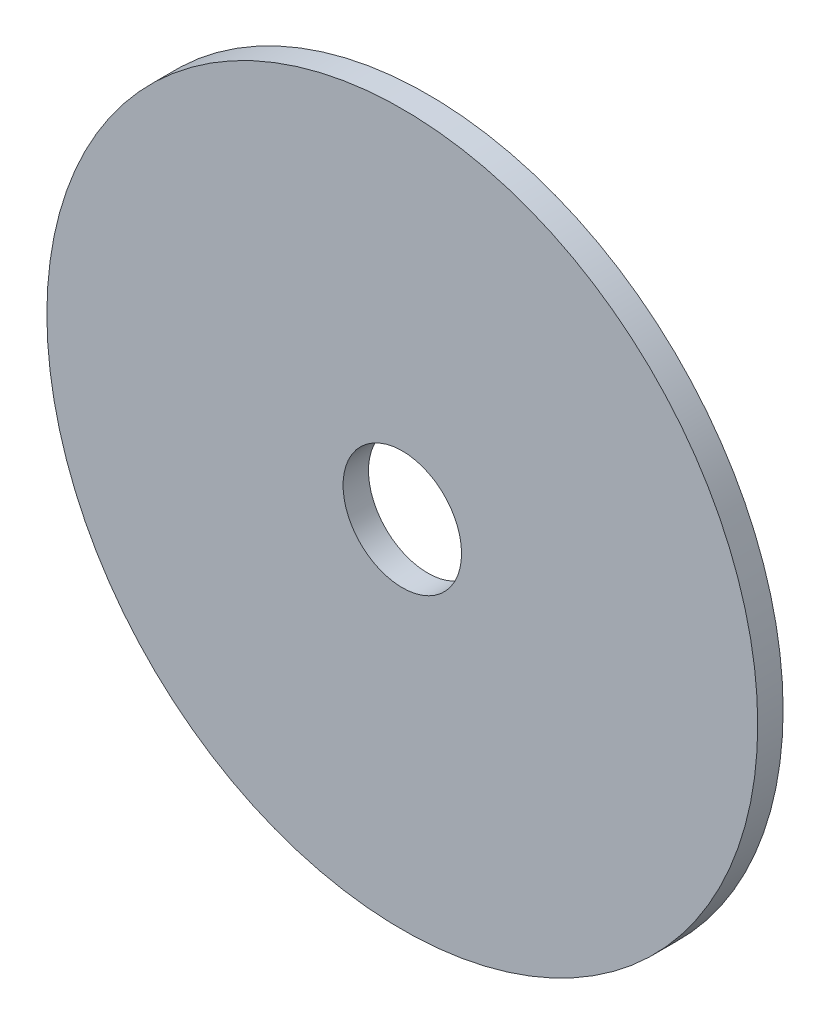
ISO-10303-21;
HEADER;
FILE_DESCRIPTION(('STEP AP214'),'2;1');
FILE_NAME('part.step','',(''),(''),'','','');
FILE_SCHEMA(('AUTOMOTIVE_DESIGN { 1 0 10303 214 1 1 1 1 }'));
ENDSEC;
DATA;
#1=APPLICATION_CONTEXT('core data for automotive mechanical design processes');
#2=APPLICATION_PROTOCOL_DEFINITION('international standard','automotive_design',2000,#1);
#3=PRODUCT_CONTEXT('',#1,'mechanical');
#4=PRODUCT('Part','Part','',(#3));
#5=PRODUCT_RELATED_PRODUCT_CATEGORY('part','',(#4));
#6=PRODUCT_DEFINITION_FORMATION('','',#4);
#7=PRODUCT_DEFINITION_CONTEXT('part definition',#1,'design');
#8=PRODUCT_DEFINITION('design','',#6,#7);
#9=PRODUCT_DEFINITION_SHAPE('','',#8);
#10=(LENGTH_UNIT() NAMED_UNIT(*) SI_UNIT(.MILLI.,.METRE.));
#11=(NAMED_UNIT(*) PLANE_ANGLE_UNIT() SI_UNIT($,.RADIAN.));
#12=(NAMED_UNIT(*) SI_UNIT($,.STERADIAN.) SOLID_ANGLE_UNIT());
#13=UNCERTAINTY_MEASURE_WITH_UNIT(LENGTH_MEASURE(1.E-05),#10,'distance_accuracy_value','');
#14=(GEOMETRIC_REPRESENTATION_CONTEXT(3) GLOBAL_UNCERTAINTY_ASSIGNED_CONTEXT((#13)) GLOBAL_UNIT_ASSIGNED_CONTEXT((#10,
#11,#12)) REPRESENTATION_CONTEXT('',''));
#15=CARTESIAN_POINT('',(0.,0.,0.));
#16=DIRECTION('',(0.,0.,1.));
#17=DIRECTION('',(1.,0.,0.));
#18=AXIS2_PLACEMENT_3D('',#15,#16,#17);
#19=CARTESIAN_POINT('',(0.,0.,0.));
#20=DIRECTION('',(0.,0.,-1.));
#21=DIRECTION('',(-1.,0.,0.));
#22=AXIS2_PLACEMENT_3D('',#19,#20,#21);
#23=PLANE('',#22);
#24=CARTESIAN_POINT('',(0.,0.,0.));
#25=DIRECTION('',(0.,0.,1.));
#26=DIRECTION('',(1.,0.,0.));
#27=AXIS2_PLACEMENT_3D('',#24,#25,#26);
#28=CIRCLE('',#27,3.5);
#29=CARTESIAN_POINT('',(3.5,0.,0.));
#30=VERTEX_POINT('',#29);
#31=EDGE_CURVE('E46',#30,#30,#28,.T.);
#32=ORIENTED_EDGE('',*,*,#31,.F.);
#33=EDGE_LOOP('',(#32));
#34=FACE_BOUND('',#33,.T.);
#35=CARTESIAN_POINT('',(0.,0.,0.));
#36=DIRECTION('',(0.,0.,1.));
#37=DIRECTION('',(1.,0.,0.));
#38=AXIS2_PLACEMENT_3D('',#35,#36,#37);
#39=CIRCLE('',#38,21.);
#40=CARTESIAN_POINT('',(21.,0.,0.));
#41=VERTEX_POINT('',#40);
#42=EDGE_CURVE('E10',#41,#41,#39,.T.);
#43=ORIENTED_EDGE('',*,*,#42,.T.);
#44=EDGE_LOOP('',(#43));
#45=FACE_BOUND('',#44,.T.);
#46=ADVANCED_FACE('F32',(#34,#45),#23,.F.);
#47=CARTESIAN_POINT('',(0.,0.,-3.21964677141295E-11));
#48=DIRECTION('',(0.,0.,1.));
#49=DIRECTION('',(1.,0.,0.));
#50=AXIS2_PLACEMENT_3D('',#47,#48,#49);
#51=CYLINDRICAL_SURFACE('',#50,21.);
#52=ORIENTED_EDGE('',*,*,#42,.F.);
#53=EDGE_LOOP('',(#52));
#54=FACE_BOUND('',#53,.T.);
#55=CARTESIAN_POINT('',(0.,0.,-1.5));
#56=DIRECTION('',(0.,0.,1.));
#57=DIRECTION('',(1.,0.,0.));
#58=AXIS2_PLACEMENT_3D('',#55,#56,#57);
#59=CIRCLE('',#58,21.);
#60=CARTESIAN_POINT('',(21.,0.,-1.5));
#61=VERTEX_POINT('',#60);
#62=EDGE_CURVE('E38',#61,#61,#59,.T.);
#63=ORIENTED_EDGE('',*,*,#62,.T.);
#64=EDGE_LOOP('',(#63));
#65=FACE_BOUND('',#64,.T.);
#66=ADVANCED_FACE('F55',(#54,#65),#51,.T.);
#67=CARTESIAN_POINT('',(0.,21.,-1.5));
#68=DIRECTION('',(0.,0.,1.));
#69=DIRECTION('',(1.,0.,0.));
#70=AXIS2_PLACEMENT_3D('',#67,#68,#69);
#71=PLANE('',#70);
#72=CARTESIAN_POINT('',(0.,0.,-1.5));
#73=DIRECTION('',(0.,0.,1.));
#74=DIRECTION('',(1.,0.,0.));
#75=AXIS2_PLACEMENT_3D('',#72,#73,#74);
#76=CIRCLE('',#75,3.5);
#77=CARTESIAN_POINT('',(3.5,0.,-1.5));
#78=VERTEX_POINT('',#77);
#79=EDGE_CURVE('E42',#78,#78,#76,.T.);
#80=ORIENTED_EDGE('',*,*,#79,.T.);
#81=EDGE_LOOP('',(#80));
#82=FACE_BOUND('',#81,.T.);
#83=ORIENTED_EDGE('',*,*,#62,.F.);
#84=EDGE_LOOP('',(#83));
#85=FACE_BOUND('',#84,.T.);
#86=ADVANCED_FACE('F59',(#82,#85),#71,.F.);
#87=CARTESIAN_POINT('',(0.,0.,-1.5));
#88=DIRECTION('',(0.,0.,1.));
#89=DIRECTION('',(1.,0.,0.));
#90=AXIS2_PLACEMENT_3D('',#87,#88,#89);
#91=CYLINDRICAL_SURFACE('',#90,3.5);
#92=ORIENTED_EDGE('',*,*,#79,.F.);
#93=EDGE_LOOP('',(#92));
#94=FACE_BOUND('',#93,.T.);
#95=ORIENTED_EDGE('',*,*,#31,.T.);
#96=EDGE_LOOP('',(#95));
#97=FACE_BOUND('',#96,.T.);
#98=ADVANCED_FACE('F52',(#94,#97),#91,.F.);
#99=CLOSED_SHELL('',(#46,#66,#86,#98));
#100=MANIFOLD_SOLID_BREP('B2',#99);
#101=ADVANCED_BREP_SHAPE_REPRESENTATION('',(#18,#100),#14);
#102=SHAPE_DEFINITION_REPRESENTATION(#9,#101);
ENDSEC;
END-ISO-10303-21;
